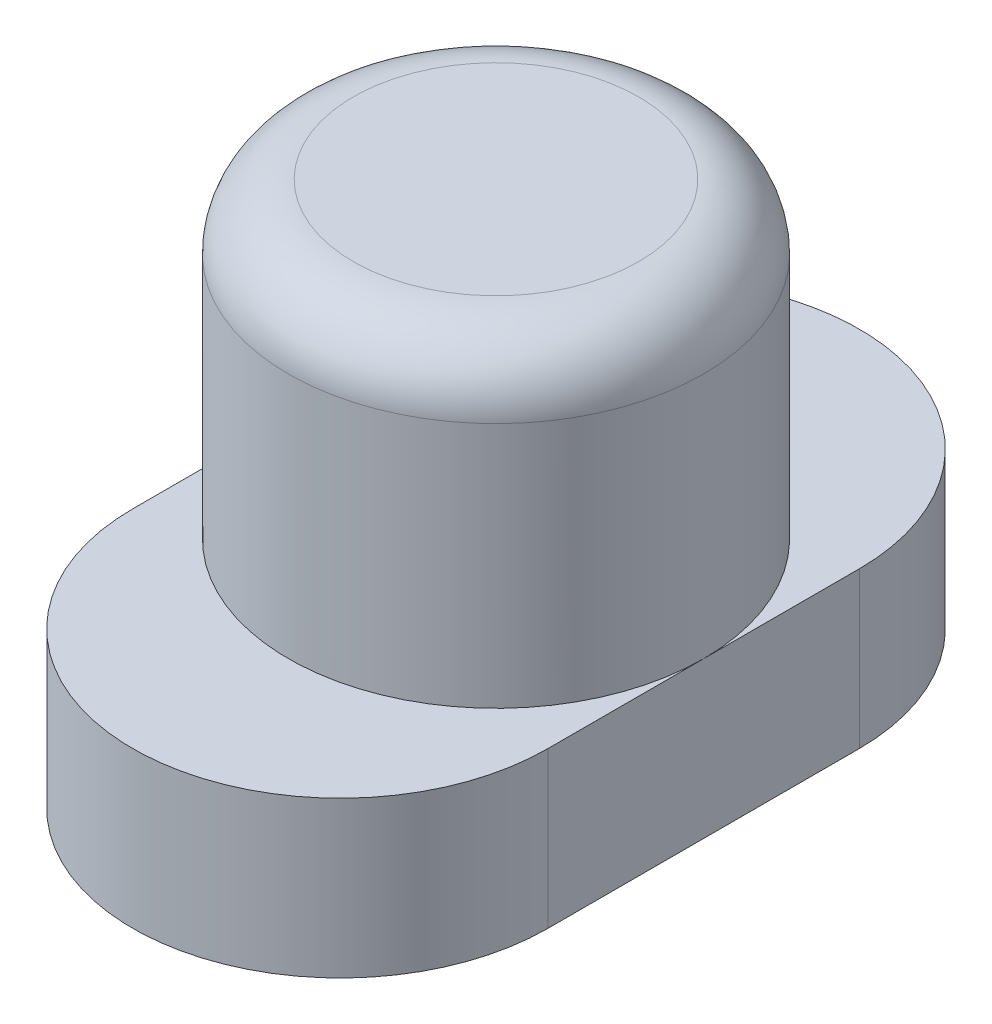
ISO-10303-21;
HEADER;
FILE_DESCRIPTION(('STEP AP214'),'2;1');
FILE_NAME('part.step','',(''),(''),'','','');
FILE_SCHEMA(('AUTOMOTIVE_DESIGN { 1 0 10303 214 1 1 1 1 }'));
ENDSEC;
DATA;
#1=APPLICATION_CONTEXT('core data for automotive mechanical design processes');
#2=APPLICATION_PROTOCOL_DEFINITION('international standard','automotive_design',2000,#1);
#3=PRODUCT_CONTEXT('',#1,'mechanical');
#4=PRODUCT('Part','Part','',(#3));
#5=PRODUCT_RELATED_PRODUCT_CATEGORY('part','',(#4));
#6=PRODUCT_DEFINITION_FORMATION('','',#4);
#7=PRODUCT_DEFINITION_CONTEXT('part definition',#1,'design');
#8=PRODUCT_DEFINITION('design','',#6,#7);
#9=PRODUCT_DEFINITION_SHAPE('','',#8);
#10=(LENGTH_UNIT() NAMED_UNIT(*) SI_UNIT(.MILLI.,.METRE.));
#11=(NAMED_UNIT(*) PLANE_ANGLE_UNIT() SI_UNIT($,.RADIAN.));
#12=(NAMED_UNIT(*) SI_UNIT($,.STERADIAN.) SOLID_ANGLE_UNIT());
#13=UNCERTAINTY_MEASURE_WITH_UNIT(LENGTH_MEASURE(1.E-05),#10,'distance_accuracy_value','');
#14=(GEOMETRIC_REPRESENTATION_CONTEXT(3) GLOBAL_UNCERTAINTY_ASSIGNED_CONTEXT((#13)) GLOBAL_UNIT_ASSIGNED_CONTEXT((#10,
#11,#12)) REPRESENTATION_CONTEXT('',''));
#15=CARTESIAN_POINT('',(0.,0.,0.));
#16=DIRECTION('',(0.,0.,1.));
#17=DIRECTION('',(1.,0.,0.));
#18=AXIS2_PLACEMENT_3D('',#15,#16,#17);
#19=CARTESIAN_POINT('',(4.,3.,0.));
#20=DIRECTION('',(0.,-1.,0.));
#21=DIRECTION('',(1.,0.,0.));
#22=AXIS2_PLACEMENT_3D('',#19,#20,#21);
#23=PLANE('',#22);
#24=CARTESIAN_POINT('',(0.,3.,3.));
#25=DIRECTION('',(0.,-1.,0.));
#26=DIRECTION('',(1.,0.,0.));
#27=AXIS2_PLACEMENT_3D('',#24,#25,#26);
#28=CIRCLE('',#27,4.);
#29=CARTESIAN_POINT('',(-4.,2.99999999999999,3.));
#30=VERTEX_POINT('',#29);
#31=CARTESIAN_POINT('',(4.,3.,3.));
#32=VERTEX_POINT('',#31);
#33=EDGE_CURVE('E11',#30,#32,#28,.F.);
#34=ORIENTED_EDGE('',*,*,#33,.T.);
#35=DIRECTION('',(0.,0.,-1.));
#36=VECTOR('',#35,1.);
#37=CARTESIAN_POINT('',(4.,3.,0.));
#38=LINE('',#37,#36);
#39=CARTESIAN_POINT('',(4.,2.99999999999999,0.));
#40=VERTEX_POINT('',#39);
#41=EDGE_CURVE('E119',#32,#40,#38,.T.);
#42=ORIENTED_EDGE('',*,*,#41,.T.);
#43=CARTESIAN_POINT('',(0.,3.,0.));
#44=DIRECTION('',(0.,1.,0.));
#45=DIRECTION('',(-1.,0.,0.));
#46=AXIS2_PLACEMENT_3D('',#43,#44,#45);
#47=CIRCLE('',#46,4.);
#48=CARTESIAN_POINT('',(-4.,2.99999999999999,0.));
#49=VERTEX_POINT('',#48);
#50=EDGE_CURVE('E174',#49,#40,#47,.T.);
#51=ORIENTED_EDGE('',*,*,#50,.F.);
#52=DIRECTION('',(0.,0.,1.));
#53=VECTOR('',#52,1.);
#54=CARTESIAN_POINT('',(-4.,2.99999999999999,0.));
#55=LINE('',#54,#53);
#56=EDGE_CURVE('E120',#49,#30,#55,.T.);
#57=ORIENTED_EDGE('',*,*,#56,.T.);
#58=EDGE_LOOP('',(#34,#42,#51,#57));
#59=FACE_BOUND('',#58,.T.);
#60=ADVANCED_FACE('F33',(#59),#23,.F.);
#61=EDGE_CURVE('E173',#40,#49,#47,.T.);
#62=ORIENTED_EDGE('',*,*,#61,.F.);
#63=CARTESIAN_POINT('',(4.,3.,-3.));
#64=VERTEX_POINT('',#63);
#65=EDGE_CURVE('E137',#40,#64,#38,.T.);
#66=ORIENTED_EDGE('',*,*,#65,.T.);
#67=CARTESIAN_POINT('',(0.,3.,-3.));
#68=DIRECTION('',(0.,-1.,0.));
#69=DIRECTION('',(1.,0.,0.));
#70=AXIS2_PLACEMENT_3D('',#67,#68,#69);
#71=CIRCLE('',#70,4.);
#72=CARTESIAN_POINT('',(-4.,2.99999999999999,-3.));
#73=VERTEX_POINT('',#72);
#74=EDGE_CURVE('E41',#64,#73,#71,.F.);
#75=ORIENTED_EDGE('',*,*,#74,.T.);
#76=EDGE_CURVE('E136',#73,#49,#55,.T.);
#77=ORIENTED_EDGE('',*,*,#76,.T.);
#78=EDGE_LOOP('',(#62,#66,#75,#77));
#79=FACE_BOUND('',#78,.T.);
#80=ADVANCED_FACE('F186',(#79),#23,.F.);
#81=CARTESIAN_POINT('',(0.,9.,0.));
#82=DIRECTION('',(0.,1.,0.));
#83=DIRECTION('',(-1.,0.,0.));
#84=AXIS2_PLACEMENT_3D('',#81,#82,#83);
#85=CYLINDRICAL_SURFACE('',#84,4.);
#86=CARTESIAN_POINT('',(0.,7.75,0.));
#87=DIRECTION('',(0.,-1.,0.));
#88=DIRECTION('',(1.,0.,0.));
#89=AXIS2_PLACEMENT_3D('',#86,#87,#88);
#90=CIRCLE('',#89,4.);
#91=CARTESIAN_POINT('',(4.,7.75,0.));
#92=VERTEX_POINT('',#91);
#93=EDGE_CURVE('E180',#92,#92,#90,.T.);
#94=ORIENTED_EDGE('',*,*,#93,.T.);
#95=EDGE_LOOP('',(#94));
#96=FACE_BOUND('',#95,.T.);
#97=ORIENTED_EDGE('',*,*,#50,.T.);
#98=ORIENTED_EDGE('',*,*,#61,.T.);
#99=EDGE_LOOP('',(#97,#98));
#100=FACE_BOUND('',#99,.T.);
#101=ADVANCED_FACE('F192',(#96,#100),#85,.T.);
#102=CARTESIAN_POINT('',(0.,9.,0.));
#103=DIRECTION('',(0.,-1.,0.));
#104=DIRECTION('',(1.,0.,0.));
#105=AXIS2_PLACEMENT_3D('',#102,#103,#104);
#106=PLANE('',#105);
#107=CARTESIAN_POINT('',(0.,9.,0.));
#108=DIRECTION('',(0.,-1.,0.));
#109=DIRECTION('',(1.,0.,0.));
#110=AXIS2_PLACEMENT_3D('',#107,#108,#109);
#111=CIRCLE('',#110,2.75);
#112=CARTESIAN_POINT('',(2.75,9.,0.));
#113=VERTEX_POINT('',#112);
#114=EDGE_CURVE('E177',#113,#113,#111,.F.);
#115=ORIENTED_EDGE('',*,*,#114,.T.);
#116=EDGE_LOOP('',(#115));
#117=FACE_BOUND('',#116,.T.);
#118=ADVANCED_FACE('F194',(#117),#106,.F.);
#119=CARTESIAN_POINT('',(0.,7.75,0.));
#120=DIRECTION('',(0.,-1.,0.));
#121=DIRECTION('',(1.,0.,0.));
#122=AXIS2_PLACEMENT_3D('',#119,#120,#121);
#123=TOROIDAL_SURFACE('',#122,2.75,1.25);
#124=ORIENTED_EDGE('',*,*,#93,.F.);
#125=EDGE_LOOP('',(#124));
#126=FACE_BOUND('',#125,.T.);
#127=ORIENTED_EDGE('',*,*,#114,.F.);
#128=EDGE_LOOP('',(#127));
#129=FACE_BOUND('',#128,.T.);
#130=ADVANCED_FACE('F35',(#126,#129),#123,.T.);
#131=CARTESIAN_POINT('',(0.,9.,3.));
#132=DIRECTION('',(0.,-1.,0.));
#133=DIRECTION('',(0.,0.,-1.));
#134=AXIS2_PLACEMENT_3D('',#131,#132,#133);
#135=CYLINDRICAL_SURFACE('',#134,4.);
#136=ORIENTED_EDGE('',*,*,#33,.F.);
#137=DIRECTION('',(0.,-1.,0.));
#138=VECTOR('',#137,1.);
#139=CARTESIAN_POINT('',(-4.,9.,3.));
#140=LINE('',#139,#138);
#141=CARTESIAN_POINT('',(-4.,0.,3.));
#142=VERTEX_POINT('',#141);
#143=EDGE_CURVE('E56',#30,#142,#140,.T.);
#144=ORIENTED_EDGE('',*,*,#143,.T.);
#145=CARTESIAN_POINT('',(0.,0.,3.));
#146=DIRECTION('',(0.,1.,0.));
#147=DIRECTION('',(0.,0.,1.));
#148=AXIS2_PLACEMENT_3D('',#145,#146,#147);
#149=CIRCLE('',#148,4.);
#150=CARTESIAN_POINT('',(4.,0.,3.));
#151=VERTEX_POINT('',#150);
#152=EDGE_CURVE('E104',#142,#151,#149,.T.);
#153=ORIENTED_EDGE('',*,*,#152,.T.);
#154=DIRECTION('',(0.,-1.,0.));
#155=VECTOR('',#154,1.);
#156=CARTESIAN_POINT('',(4.,9.,3.));
#157=LINE('',#156,#155);
#158=EDGE_CURVE('E107',#32,#151,#157,.T.);
#159=ORIENTED_EDGE('',*,*,#158,.F.);
#160=EDGE_LOOP('',(#136,#144,#153,#159));
#161=FACE_BOUND('',#160,.T.);
#162=ADVANCED_FACE('F106',(#161),#135,.T.);
#163=CARTESIAN_POINT('',(0.,9.,-3.));
#164=DIRECTION('',(0.,-1.,0.));
#165=DIRECTION('',(0.,0.,-1.));
#166=AXIS2_PLACEMENT_3D('',#163,#164,#165);
#167=CYLINDRICAL_SURFACE('',#166,4.);
#168=ORIENTED_EDGE('',*,*,#74,.F.);
#169=DIRECTION('',(0.,-1.,0.));
#170=VECTOR('',#169,1.);
#171=CARTESIAN_POINT('',(4.,9.,-3.));
#172=LINE('',#171,#170);
#173=CARTESIAN_POINT('',(4.,0.,-3.));
#174=VERTEX_POINT('',#173);
#175=EDGE_CURVE('E121',#64,#174,#172,.T.);
#176=ORIENTED_EDGE('',*,*,#175,.T.);
#177=CARTESIAN_POINT('',(0.,0.,-3.));
#178=DIRECTION('',(0.,1.,0.));
#179=DIRECTION('',(0.,0.,1.));
#180=AXIS2_PLACEMENT_3D('',#177,#178,#179);
#181=CIRCLE('',#180,4.);
#182=CARTESIAN_POINT('',(-4.,0.,-3.));
#183=VERTEX_POINT('',#182);
#184=EDGE_CURVE('E48',#174,#183,#181,.T.);
#185=ORIENTED_EDGE('',*,*,#184,.T.);
#186=DIRECTION('',(0.,-1.,0.));
#187=VECTOR('',#186,1.);
#188=CARTESIAN_POINT('',(-4.,9.,-3.));
#189=LINE('',#188,#187);
#190=EDGE_CURVE('E131',#73,#183,#189,.T.);
#191=ORIENTED_EDGE('',*,*,#190,.F.);
#192=EDGE_LOOP('',(#168,#176,#185,#191));
#193=FACE_BOUND('',#192,.T.);
#194=ADVANCED_FACE('F188',(#193),#167,.T.);
#195=CARTESIAN_POINT('',(4.,9.,3.));
#196=DIRECTION('',(-1.,0.,0.));
#197=DIRECTION('',(0.,0.,1.));
#198=AXIS2_PLACEMENT_3D('',#195,#196,#197);
#199=PLANE('',#198);
#200=ORIENTED_EDGE('',*,*,#158,.T.);
#201=DIRECTION('',(0.,0.,-1.));
#202=VECTOR('',#201,1.);
#203=CARTESIAN_POINT('',(4.,0.,3.));
#204=LINE('',#203,#202);
#205=EDGE_CURVE('E111',#151,#174,#204,.T.);
#206=ORIENTED_EDGE('',*,*,#205,.T.);
#207=ORIENTED_EDGE('',*,*,#175,.F.);
#208=ORIENTED_EDGE('',*,*,#65,.F.);
#209=ORIENTED_EDGE('',*,*,#41,.F.);
#210=EDGE_LOOP('',(#200,#206,#207,#208,#209));
#211=FACE_BOUND('',#210,.T.);
#212=ADVANCED_FACE('F116',(#211),#199,.F.);
#213=CARTESIAN_POINT('',(-4.,9.,3.));
#214=DIRECTION('',(1.,0.,0.));
#215=DIRECTION('',(0.,0.,-1.));
#216=AXIS2_PLACEMENT_3D('',#213,#214,#215);
#217=PLANE('',#216);
#218=ORIENTED_EDGE('',*,*,#190,.T.);
#219=DIRECTION('',(0.,0.,1.));
#220=VECTOR('',#219,1.);
#221=CARTESIAN_POINT('',(-4.,0.,3.));
#222=LINE('',#221,#220);
#223=EDGE_CURVE('E126',#183,#142,#222,.T.);
#224=ORIENTED_EDGE('',*,*,#223,.T.);
#225=ORIENTED_EDGE('',*,*,#143,.F.);
#226=ORIENTED_EDGE('',*,*,#56,.F.);
#227=ORIENTED_EDGE('',*,*,#76,.F.);
#228=EDGE_LOOP('',(#218,#224,#225,#226,#227));
#229=FACE_BOUND('',#228,.T.);
#230=ADVANCED_FACE('F232',(#229),#217,.F.);
#231=CARTESIAN_POINT('',(0.,3.5,0.));
#232=DIRECTION('',(0.,1.,0.));
#233=DIRECTION('',(-1.,0.,0.));
#234=AXIS2_PLACEMENT_3D('',#231,#232,#233);
#235=PLANE('',#234);
#236=DIRECTION('',(0.,0.,1.));
#237=VECTOR('',#236,1.);
#238=CARTESIAN_POINT('',(-1.75,3.5,-1.25));
#239=LINE('',#238,#237);
#240=CARTESIAN_POINT('',(-1.75,3.5,-1.25));
#241=VERTEX_POINT('',#240);
#242=CARTESIAN_POINT('',(-1.75,3.5,1.25));
#243=VERTEX_POINT('',#242);
#244=EDGE_CURVE('E140',#241,#243,#239,.T.);
#245=ORIENTED_EDGE('',*,*,#244,.F.);
#246=DIRECTION('',(1.,0.,0.));
#247=VECTOR('',#246,1.);
#248=CARTESIAN_POINT('',(-1.75,3.5,-1.25));
#249=LINE('',#248,#247);
#250=CARTESIAN_POINT('',(1.75,3.5,-1.25));
#251=VERTEX_POINT('',#250);
#252=EDGE_CURVE('E149',#241,#251,#249,.T.);
#253=ORIENTED_EDGE('',*,*,#252,.T.);
#254=DIRECTION('',(0.,0.,1.));
#255=VECTOR('',#254,1.);
#256=CARTESIAN_POINT('',(1.75,3.5,-1.25));
#257=LINE('',#256,#255);
#258=CARTESIAN_POINT('',(1.75,3.5,1.25));
#259=VERTEX_POINT('',#258);
#260=EDGE_CURVE('E146',#251,#259,#257,.T.);
#261=ORIENTED_EDGE('',*,*,#260,.T.);
#262=DIRECTION('',(1.,0.,0.));
#263=VECTOR('',#262,1.);
#264=CARTESIAN_POINT('',(-1.75,3.5,1.25));
#265=LINE('',#264,#263);
#266=EDGE_CURVE('E143',#243,#259,#265,.T.);
#267=ORIENTED_EDGE('',*,*,#266,.F.);
#268=EDGE_LOOP('',(#245,#253,#261,#267));
#269=FACE_BOUND('',#268,.T.);
#270=ADVANCED_FACE('F228',(#269),#235,.F.);
#271=CARTESIAN_POINT('',(-1.75,3.5,-1.25));
#272=DIRECTION('',(0.,0.,-1.));
#273=DIRECTION('',(-1.,0.,0.));
#274=AXIS2_PLACEMENT_3D('',#271,#272,#273);
#275=PLANE('',#274);
#276=DIRECTION('',(1.,0.,0.));
#277=VECTOR('',#276,1.);
#278=CARTESIAN_POINT('',(-1.75,0.,-1.25));
#279=LINE('',#278,#277);
#280=CARTESIAN_POINT('',(-1.75,0.,-1.25));
#281=VERTEX_POINT('',#280);
#282=CARTESIAN_POINT('',(1.75,0.,-1.25));
#283=VERTEX_POINT('',#282);
#284=EDGE_CURVE('E144',#281,#283,#279,.T.);
#285=ORIENTED_EDGE('',*,*,#284,.T.);
#286=DIRECTION('',(0.,-1.,0.));
#287=VECTOR('',#286,1.);
#288=CARTESIAN_POINT('',(1.75,3.5,-1.25));
#289=LINE('',#288,#287);
#290=EDGE_CURVE('E166',#251,#283,#289,.T.);
#291=ORIENTED_EDGE('',*,*,#290,.F.);
#292=ORIENTED_EDGE('',*,*,#252,.F.);
#293=DIRECTION('',(0.,-1.,0.));
#294=VECTOR('',#293,1.);
#295=CARTESIAN_POINT('',(-1.75,3.5,-1.25));
#296=LINE('',#295,#294);
#297=EDGE_CURVE('E152',#241,#281,#296,.T.);
#298=ORIENTED_EDGE('',*,*,#297,.T.);
#299=EDGE_LOOP('',(#285,#291,#292,#298));
#300=FACE_BOUND('',#299,.T.);
#301=ADVANCED_FACE('F224',(#300),#275,.F.);
#302=CARTESIAN_POINT('',(1.75,3.5,-1.25));
#303=DIRECTION('',(1.,0.,0.));
#304=DIRECTION('',(0.,1.,0.));
#305=AXIS2_PLACEMENT_3D('',#302,#303,#304);
#306=PLANE('',#305);
#307=DIRECTION('',(0.,0.,1.));
#308=VECTOR('',#307,1.);
#309=CARTESIAN_POINT('',(1.75,0.,-1.25));
#310=LINE('',#309,#308);
#311=CARTESIAN_POINT('',(1.75,0.,1.25));
#312=VERTEX_POINT('',#311);
#313=EDGE_CURVE('E159',#283,#312,#310,.T.);
#314=ORIENTED_EDGE('',*,*,#313,.T.);
#315=DIRECTION('',(0.,-1.,0.));
#316=VECTOR('',#315,1.);
#317=CARTESIAN_POINT('',(1.75,3.5,1.25));
#318=LINE('',#317,#316);
#319=EDGE_CURVE('E168',#259,#312,#318,.T.);
#320=ORIENTED_EDGE('',*,*,#319,.F.);
#321=ORIENTED_EDGE('',*,*,#260,.F.);
#322=ORIENTED_EDGE('',*,*,#290,.T.);
#323=EDGE_LOOP('',(#314,#320,#321,#322));
#324=FACE_BOUND('',#323,.T.);
#325=ADVANCED_FACE('F218',(#324),#306,.F.);
#326=CARTESIAN_POINT('',(-1.75,3.5,1.25));
#327=DIRECTION('',(0.,0.,-1.));
#328=DIRECTION('',(-1.,0.,0.));
#329=AXIS2_PLACEMENT_3D('',#326,#327,#328);
#330=PLANE('',#329);
#331=DIRECTION('',(1.,0.,0.));
#332=VECTOR('',#331,1.);
#333=CARTESIAN_POINT('',(-1.75,0.,1.25));
#334=LINE('',#333,#332);
#335=CARTESIAN_POINT('',(-1.75,0.,1.25));
#336=VERTEX_POINT('',#335);
#337=EDGE_CURVE('E156',#336,#312,#334,.T.);
#338=ORIENTED_EDGE('',*,*,#337,.F.);
#339=DIRECTION('',(0.,-1.,0.));
#340=VECTOR('',#339,1.);
#341=CARTESIAN_POINT('',(-1.75,3.5,1.25));
#342=LINE('',#341,#340);
#343=EDGE_CURVE('E170',#243,#336,#342,.T.);
#344=ORIENTED_EDGE('',*,*,#343,.F.);
#345=ORIENTED_EDGE('',*,*,#266,.T.);
#346=ORIENTED_EDGE('',*,*,#319,.T.);
#347=EDGE_LOOP('',(#338,#344,#345,#346));
#348=FACE_BOUND('',#347,.T.);
#349=ADVANCED_FACE('F212',(#348),#330,.T.);
#350=CARTESIAN_POINT('',(-1.75,3.5,-1.25));
#351=DIRECTION('',(1.,0.,0.));
#352=DIRECTION('',(0.,1.,0.));
#353=AXIS2_PLACEMENT_3D('',#350,#351,#352);
#354=PLANE('',#353);
#355=DIRECTION('',(0.,0.,1.));
#356=VECTOR('',#355,1.);
#357=CARTESIAN_POINT('',(-1.75,0.,-1.25));
#358=LINE('',#357,#356);
#359=EDGE_CURVE('E153',#281,#336,#358,.T.);
#360=ORIENTED_EDGE('',*,*,#359,.F.);
#361=ORIENTED_EDGE('',*,*,#297,.F.);
#362=ORIENTED_EDGE('',*,*,#244,.T.);
#363=ORIENTED_EDGE('',*,*,#343,.T.);
#364=EDGE_LOOP('',(#360,#361,#362,#363));
#365=FACE_BOUND('',#364,.T.);
#366=ADVANCED_FACE('F208',(#365),#354,.T.);
#367=CARTESIAN_POINT('',(0.,0.,0.));
#368=DIRECTION('',(0.,1.,0.));
#369=DIRECTION('',(-1.,0.,0.));
#370=AXIS2_PLACEMENT_3D('',#367,#368,#369);
#371=PLANE('',#370);
#372=ORIENTED_EDGE('',*,*,#205,.F.);
#373=ORIENTED_EDGE('',*,*,#152,.F.);
#374=ORIENTED_EDGE('',*,*,#223,.F.);
#375=ORIENTED_EDGE('',*,*,#184,.F.);
#376=EDGE_LOOP('',(#372,#373,#374,#375));
#377=FACE_BOUND('',#376,.T.);
#378=ORIENTED_EDGE('',*,*,#359,.T.);
#379=ORIENTED_EDGE('',*,*,#337,.T.);
#380=ORIENTED_EDGE('',*,*,#313,.F.);
#381=ORIENTED_EDGE('',*,*,#284,.F.);
#382=EDGE_LOOP('',(#378,#379,#380,#381));
#383=FACE_BOUND('',#382,.T.);
#384=ADVANCED_FACE('F123',(#377,#383),#371,.F.);
#385=CLOSED_SHELL('',(#60,#80,#101,#118,#130,#162,#194,#212,#230,#270,#301,#325,#349,#366,#384));
#386=MANIFOLD_SOLID_BREP('B2',#385);
#387=ADVANCED_BREP_SHAPE_REPRESENTATION('',(#18,#386),#14);
#388=SHAPE_DEFINITION_REPRESENTATION(#9,#387);
ENDSEC;
END-ISO-10303-21;
